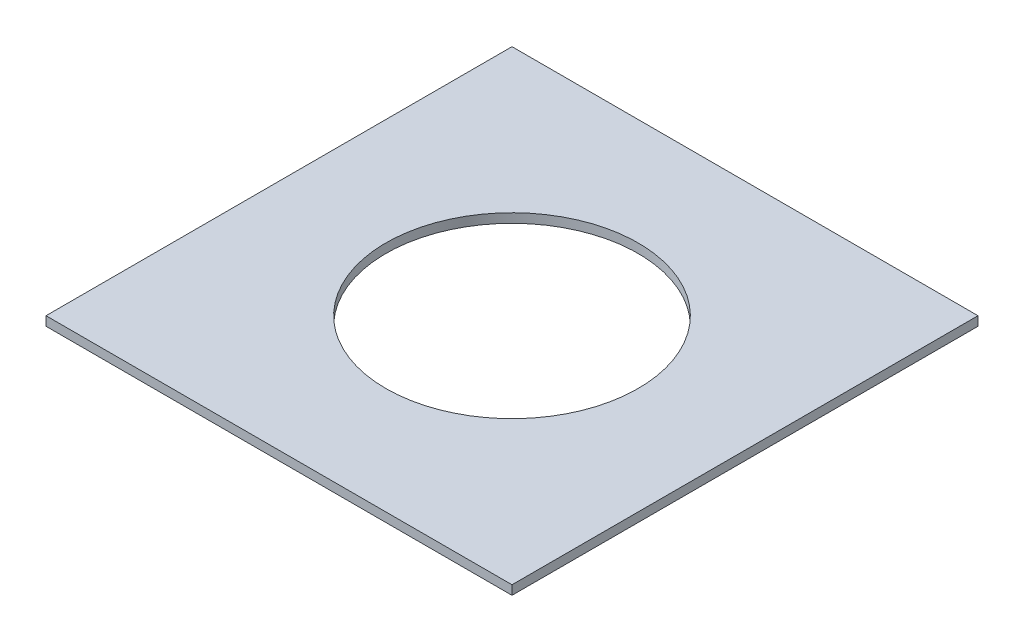
ISO-10303-21;
HEADER;
FILE_DESCRIPTION(('STEP AP214'),'2;1');
FILE_NAME('part.step','',(''),(''),'','','');
FILE_SCHEMA(('AUTOMOTIVE_DESIGN { 1 0 10303 214 1 1 1 1 }'));
ENDSEC;
DATA;
#1=APPLICATION_CONTEXT('core data for automotive mechanical design processes');
#2=APPLICATION_PROTOCOL_DEFINITION('international standard','automotive_design',2000,#1);
#3=PRODUCT_CONTEXT('',#1,'mechanical');
#4=PRODUCT('Part','Part','',(#3));
#5=PRODUCT_RELATED_PRODUCT_CATEGORY('part','',(#4));
#6=PRODUCT_DEFINITION_FORMATION('','',#4);
#7=PRODUCT_DEFINITION_CONTEXT('part definition',#1,'design');
#8=PRODUCT_DEFINITION('design','',#6,#7);
#9=PRODUCT_DEFINITION_SHAPE('','',#8);
#10=(LENGTH_UNIT() NAMED_UNIT(*) SI_UNIT(.MILLI.,.METRE.));
#11=(NAMED_UNIT(*) PLANE_ANGLE_UNIT() SI_UNIT($,.RADIAN.));
#12=(NAMED_UNIT(*) SI_UNIT($,.STERADIAN.) SOLID_ANGLE_UNIT());
#13=UNCERTAINTY_MEASURE_WITH_UNIT(LENGTH_MEASURE(1.E-05),#10,'distance_accuracy_value','');
#14=(GEOMETRIC_REPRESENTATION_CONTEXT(3) GLOBAL_UNCERTAINTY_ASSIGNED_CONTEXT((#13)) GLOBAL_UNIT_ASSIGNED_CONTEXT((#10,
#11,#12)) REPRESENTATION_CONTEXT('',''));
#15=CARTESIAN_POINT('',(0.,0.,0.));
#16=DIRECTION('',(0.,0.,1.));
#17=DIRECTION('',(1.,0.,0.));
#18=AXIS2_PLACEMENT_3D('',#15,#16,#17);
#19=CARTESIAN_POINT('',(0.,2.,0.));
#20=DIRECTION('',(0.,1.,0.));
#21=DIRECTION('',(0.,0.,1.));
#22=AXIS2_PLACEMENT_3D('',#19,#20,#21);
#23=PLANE('',#22);
#24=DIRECTION('',(0.,0.,-1.));
#25=VECTOR('',#24,1.);
#26=CARTESIAN_POINT('',(50.8,2.,-50.8));
#27=LINE('',#26,#25);
#28=CARTESIAN_POINT('',(50.8,2.,50.8));
#29=VERTEX_POINT('',#28);
#30=CARTESIAN_POINT('',(50.8,2.,-50.8));
#31=VERTEX_POINT('',#30);
#32=EDGE_CURVE('E85',#29,#31,#27,.T.);
#33=ORIENTED_EDGE('',*,*,#32,.T.);
#34=DIRECTION('',(-1.,0.,0.));
#35=VECTOR('',#34,1.);
#36=CARTESIAN_POINT('',(-50.8,2.,-50.8));
#37=LINE('',#36,#35);
#38=CARTESIAN_POINT('',(-50.8,2.,-50.8));
#39=VERTEX_POINT('',#38);
#40=EDGE_CURVE('E80',#31,#39,#37,.T.);
#41=ORIENTED_EDGE('',*,*,#40,.T.);
#42=DIRECTION('',(0.,0.,1.));
#43=VECTOR('',#42,1.);
#44=CARTESIAN_POINT('',(-50.8,2.,-50.8));
#45=LINE('',#44,#43);
#46=CARTESIAN_POINT('',(-50.8,2.,50.8));
#47=VERTEX_POINT('',#46);
#48=EDGE_CURVE('E83',#39,#47,#45,.T.);
#49=ORIENTED_EDGE('',*,*,#48,.T.);
#50=DIRECTION('',(1.,0.,0.));
#51=VECTOR('',#50,1.);
#52=CARTESIAN_POINT('',(-50.8,2.,50.8));
#53=LINE('',#52,#51);
#54=EDGE_CURVE('E50',#47,#29,#53,.T.);
#55=ORIENTED_EDGE('',*,*,#54,.T.);
#56=EDGE_LOOP('',(#33,#41,#49,#55));
#57=FACE_BOUND('',#56,.T.);
#58=CARTESIAN_POINT('',(0.,2.,0.));
#59=DIRECTION('',(0.,1.,0.));
#60=DIRECTION('',(0.,0.,1.));
#61=AXIS2_PLACEMENT_3D('',#58,#59,#60);
#62=CIRCLE('',#61,27.5);
#63=CARTESIAN_POINT('',(0.,2.,27.5));
#64=VERTEX_POINT('',#63);
#65=EDGE_CURVE('E100',#64,#64,#62,.T.);
#66=ORIENTED_EDGE('',*,*,#65,.F.);
#67=EDGE_LOOP('',(#66));
#68=FACE_BOUND('',#67,.T.);
#69=ADVANCED_FACE('F33',(#57,#68),#23,.T.);
#70=CARTESIAN_POINT('',(0.,0.,0.));
#71=DIRECTION('',(0.,1.,0.));
#72=DIRECTION('',(0.,0.,1.));
#73=AXIS2_PLACEMENT_3D('',#70,#71,#72);
#74=PLANE('',#73);
#75=DIRECTION('',(0.,0.,-1.));
#76=VECTOR('',#75,1.);
#77=CARTESIAN_POINT('',(50.8,0.,-50.8));
#78=LINE('',#77,#76);
#79=CARTESIAN_POINT('',(50.8,0.,50.8));
#80=VERTEX_POINT('',#79);
#81=CARTESIAN_POINT('',(50.8,0.,-50.8));
#82=VERTEX_POINT('',#81);
#83=EDGE_CURVE('E97',#80,#82,#78,.T.);
#84=ORIENTED_EDGE('',*,*,#83,.F.);
#85=DIRECTION('',(1.,0.,0.));
#86=VECTOR('',#85,1.);
#87=CARTESIAN_POINT('',(-50.8,0.,50.8));
#88=LINE('',#87,#86);
#89=CARTESIAN_POINT('',(-50.8,0.,50.8));
#90=VERTEX_POINT('',#89);
#91=EDGE_CURVE('E73',#90,#80,#88,.T.);
#92=ORIENTED_EDGE('',*,*,#91,.F.);
#93=DIRECTION('',(0.,0.,1.));
#94=VECTOR('',#93,1.);
#95=CARTESIAN_POINT('',(-50.8,0.,-50.8));
#96=LINE('',#95,#94);
#97=CARTESIAN_POINT('',(-50.8,0.,-50.8));
#98=VERTEX_POINT('',#97);
#99=EDGE_CURVE('E67',#98,#90,#96,.T.);
#100=ORIENTED_EDGE('',*,*,#99,.F.);
#101=DIRECTION('',(-1.,0.,0.));
#102=VECTOR('',#101,1.);
#103=CARTESIAN_POINT('',(-50.8,0.,-50.8));
#104=LINE('',#103,#102);
#105=EDGE_CURVE('E89',#82,#98,#104,.T.);
#106=ORIENTED_EDGE('',*,*,#105,.F.);
#107=EDGE_LOOP('',(#84,#92,#100,#106));
#108=FACE_BOUND('',#107,.T.);
#109=CARTESIAN_POINT('',(0.,0.,0.));
#110=DIRECTION('',(0.,1.,0.));
#111=DIRECTION('',(0.,0.,1.));
#112=AXIS2_PLACEMENT_3D('',#109,#110,#111);
#113=CIRCLE('',#112,27.5);
#114=CARTESIAN_POINT('',(0.,0.,27.5));
#115=VERTEX_POINT('',#114);
#116=EDGE_CURVE('E112',#115,#115,#113,.T.);
#117=ORIENTED_EDGE('',*,*,#116,.T.);
#118=EDGE_LOOP('',(#117));
#119=FACE_BOUND('',#118,.T.);
#120=ADVANCED_FACE('F108',(#108,#119),#74,.F.);
#121=CARTESIAN_POINT('',(50.8,2.,-50.8));
#122=DIRECTION('',(-1.,0.,0.));
#123=DIRECTION('',(0.,0.,1.));
#124=AXIS2_PLACEMENT_3D('',#121,#122,#123);
#125=PLANE('',#124);
#126=ORIENTED_EDGE('',*,*,#83,.T.);
#127=DIRECTION('',(0.,-1.,0.));
#128=VECTOR('',#127,1.);
#129=CARTESIAN_POINT('',(50.8,2.,-50.8));
#130=LINE('',#129,#128);
#131=EDGE_CURVE('E11',#31,#82,#130,.T.);
#132=ORIENTED_EDGE('',*,*,#131,.F.);
#133=ORIENTED_EDGE('',*,*,#32,.F.);
#134=DIRECTION('',(0.,-1.,0.));
#135=VECTOR('',#134,1.);
#136=CARTESIAN_POINT('',(50.8,2.,50.8));
#137=LINE('',#136,#135);
#138=EDGE_CURVE('E93',#29,#80,#137,.T.);
#139=ORIENTED_EDGE('',*,*,#138,.T.);
#140=EDGE_LOOP('',(#126,#132,#133,#139));
#141=FACE_BOUND('',#140,.T.);
#142=ADVANCED_FACE('F35',(#141),#125,.F.);
#143=CARTESIAN_POINT('',(-50.8,2.,-50.8));
#144=DIRECTION('',(0.,0.,1.));
#145=DIRECTION('',(1.,0.,0.));
#146=AXIS2_PLACEMENT_3D('',#143,#144,#145);
#147=PLANE('',#146);
#148=ORIENTED_EDGE('',*,*,#105,.T.);
#149=DIRECTION('',(0.,-1.,0.));
#150=VECTOR('',#149,1.);
#151=CARTESIAN_POINT('',(-50.8,2.,-50.8));
#152=LINE('',#151,#150);
#153=EDGE_CURVE('E42',#39,#98,#152,.T.);
#154=ORIENTED_EDGE('',*,*,#153,.F.);
#155=ORIENTED_EDGE('',*,*,#40,.F.);
#156=ORIENTED_EDGE('',*,*,#131,.T.);
#157=EDGE_LOOP('',(#148,#154,#155,#156));
#158=FACE_BOUND('',#157,.T.);
#159=ADVANCED_FACE('F88',(#158),#147,.F.);
#160=CARTESIAN_POINT('',(-50.8,2.,-50.8));
#161=DIRECTION('',(1.,0.,0.));
#162=DIRECTION('',(0.,0.,-1.));
#163=AXIS2_PLACEMENT_3D('',#160,#161,#162);
#164=PLANE('',#163);
#165=ORIENTED_EDGE('',*,*,#99,.T.);
#166=DIRECTION('',(0.,-1.,0.));
#167=VECTOR('',#166,1.);
#168=CARTESIAN_POINT('',(-50.8,2.,50.8));
#169=LINE('',#168,#167);
#170=EDGE_CURVE('E90',#47,#90,#169,.T.);
#171=ORIENTED_EDGE('',*,*,#170,.F.);
#172=ORIENTED_EDGE('',*,*,#48,.F.);
#173=ORIENTED_EDGE('',*,*,#153,.T.);
#174=EDGE_LOOP('',(#165,#171,#172,#173));
#175=FACE_BOUND('',#174,.T.);
#176=ADVANCED_FACE('F91',(#175),#164,.F.);
#177=CARTESIAN_POINT('',(-50.8,2.,50.8));
#178=DIRECTION('',(0.,0.,-1.));
#179=DIRECTION('',(-1.,0.,0.));
#180=AXIS2_PLACEMENT_3D('',#177,#178,#179);
#181=PLANE('',#180);
#182=ORIENTED_EDGE('',*,*,#91,.T.);
#183=ORIENTED_EDGE('',*,*,#138,.F.);
#184=ORIENTED_EDGE('',*,*,#54,.F.);
#185=ORIENTED_EDGE('',*,*,#170,.T.);
#186=EDGE_LOOP('',(#182,#183,#184,#185));
#187=FACE_BOUND('',#186,.T.);
#188=ADVANCED_FACE('F105',(#187),#181,.F.);
#189=CARTESIAN_POINT('',(0.,2.,0.));
#190=DIRECTION('',(0.,-1.,0.));
#191=DIRECTION('',(0.,0.,-1.));
#192=AXIS2_PLACEMENT_3D('',#189,#190,#191);
#193=CYLINDRICAL_SURFACE('',#192,27.5);
#194=ORIENTED_EDGE('',*,*,#65,.T.);
#195=EDGE_LOOP('',(#194));
#196=FACE_BOUND('',#195,.T.);
#197=ORIENTED_EDGE('',*,*,#116,.F.);
#198=EDGE_LOOP('',(#197));
#199=FACE_BOUND('',#198,.T.);
#200=ADVANCED_FACE('F118',(#196,#199),#193,.F.);
#201=CLOSED_SHELL('',(#69,#120,#142,#159,#176,#188,#200));
#202=MANIFOLD_SOLID_BREP('B2',#201);
#203=ADVANCED_BREP_SHAPE_REPRESENTATION('',(#18,#202),#14);
#204=SHAPE_DEFINITION_REPRESENTATION(#9,#203);
ENDSEC;
END-ISO-10303-21;
